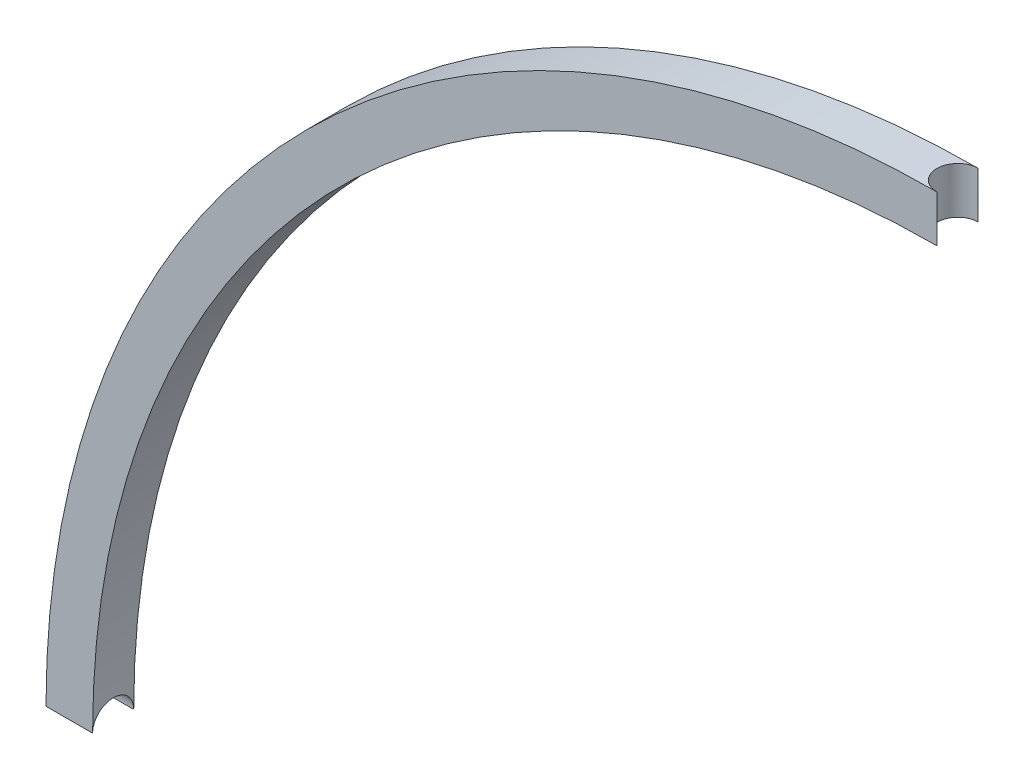
ISO-10303-21;
HEADER;
FILE_DESCRIPTION(('STEP AP214'),'2;1');
FILE_NAME('part.step','',(''),(''),'','','');
FILE_SCHEMA(('AUTOMOTIVE_DESIGN { 1 0 10303 214 1 1 1 1 }'));
ENDSEC;
DATA;
#1=APPLICATION_CONTEXT('core data for automotive mechanical design processes');
#2=APPLICATION_PROTOCOL_DEFINITION('international standard','automotive_design',2000,#1);
#3=PRODUCT_CONTEXT('',#1,'mechanical');
#4=PRODUCT('Part','Part','',(#3));
#5=PRODUCT_RELATED_PRODUCT_CATEGORY('part','',(#4));
#6=PRODUCT_DEFINITION_FORMATION('','',#4);
#7=PRODUCT_DEFINITION_CONTEXT('part definition',#1,'design');
#8=PRODUCT_DEFINITION('design','',#6,#7);
#9=PRODUCT_DEFINITION_SHAPE('','',#8);
#10=(LENGTH_UNIT() NAMED_UNIT(*) SI_UNIT(.MILLI.,.METRE.));
#11=(NAMED_UNIT(*) PLANE_ANGLE_UNIT() SI_UNIT($,.RADIAN.));
#12=(NAMED_UNIT(*) SI_UNIT($,.STERADIAN.) SOLID_ANGLE_UNIT());
#13=UNCERTAINTY_MEASURE_WITH_UNIT(LENGTH_MEASURE(1.E-05),#10,'distance_accuracy_value','');
#14=(GEOMETRIC_REPRESENTATION_CONTEXT(3) GLOBAL_UNCERTAINTY_ASSIGNED_CONTEXT((#13)) GLOBAL_UNIT_ASSIGNED_CONTEXT((#10,
#11,#12)) REPRESENTATION_CONTEXT('',''));
#15=CARTESIAN_POINT('',(0.,0.,0.));
#16=DIRECTION('',(0.,0.,1.));
#17=DIRECTION('',(1.,0.,0.));
#18=AXIS2_PLACEMENT_3D('',#15,#16,#17);
#19=CARTESIAN_POINT('',(0.,0.,6.));
#20=DIRECTION('',(0.,0.,-1.));
#21=DIRECTION('',(-1.,0.,0.));
#22=AXIS2_PLACEMENT_3D('',#19,#20,#21);
#23=CYLINDRICAL_SURFACE('',#22,130.);
#24=CARTESIAN_POINT('',(0.,0.,0.));
#25=DIRECTION('',(0.,0.,1.));
#26=DIRECTION('',(1.,0.,0.));
#27=AXIS2_PLACEMENT_3D('',#24,#25,#26);
#28=CIRCLE('',#27,130.);
#29=CARTESIAN_POINT('',(0.,130.,0.));
#30=VERTEX_POINT('',#29);
#31=CARTESIAN_POINT('',(-130.,0.,0.));
#32=VERTEX_POINT('',#31);
#33=EDGE_CURVE('E89',#30,#32,#28,.T.);
#34=ORIENTED_EDGE('',*,*,#33,.T.);
#35=CARTESIAN_POINT('',(-130.,0.,0.));
#36=CARTESIAN_POINT('',(-130.000000798049,0.084365703153941,-8.0962971110896E-06));
#37=CARTESIAN_POINT('',(-129.999917890793,0.168727556980415,0.00355875628193239));
#38=CARTESIAN_POINT('',(-129.999590558508,0.336847488970043,0.0177796983456663));
#39=CARTESIAN_POINT('',(-129.999346141371,0.420605596433004,0.0284334415308318));
#40=CARTESIAN_POINT('',(-129.998701911036,0.586870972359873,0.0567554061771578));
#41=CARTESIAN_POINT('',(-129.998302208857,0.669379090794983,0.0744186165310262));
#42=CARTESIAN_POINT('',(-129.997359444009,0.832593508303136,0.116616044330132));
#43=CARTESIAN_POINT('',(-129.996816383052,0.913299828883487,0.14115017971261));
#44=CARTESIAN_POINT('',(-129.994993140816,1.15193410518712,0.224859320547902));
#45=CARTESIAN_POINT('',(-129.993518605069,1.30644859979234,0.294153258378511));
#46=CARTESIAN_POINT('',(-129.990218638762,1.60153503918207,0.457644083543427));
#47=CARTESIAN_POINT('',(-129.988393275742,1.74210965969144,0.551836178963864));
#48=CARTESIAN_POINT('',(-129.984596472131,2.00550312142936,0.762505016025617));
#49=CARTESIAN_POINT('',(-129.982625004173,2.12831862322374,0.878985939327627));
#50=CARTESIAN_POINT('',(-129.978758245697,2.35266551308455,1.13092870158513));
#51=CARTESIAN_POINT('',(-129.976862966826,2.45419365730254,1.26639342812506));
#52=CARTESIAN_POINT('',(-129.9733624625,2.63307469087769,1.55245886178118));
#53=CARTESIAN_POINT('',(-129.971757256658,2.71042594587225,1.70306059125275));
#54=CARTESIAN_POINT('',(-129.969018225417,2.83873992133768,2.01510721109682));
#55=CARTESIAN_POINT('',(-129.967884369352,2.88970435868908,2.17655139522349));
#56=CARTESIAN_POINT('',(-129.966215952477,2.9637980011571,2.5056815069665));
#57=CARTESIAN_POINT('',(-129.965681295763,2.98693166077816,2.67336643127956));
#58=CARTESIAN_POINT('',(-129.965271270454,3.00472070422374,3.01024466723867));
#59=CARTESIAN_POINT('',(-129.965395916155,2.99937547045241,3.17943801151702));
#60=CARTESIAN_POINT('',(-129.966290372642,2.96036135808274,3.51449061284905));
#61=CARTESIAN_POINT('',(-129.967060054007,2.92669816116601,3.68035053188264));
#62=CARTESIAN_POINT('',(-129.969157605201,2.83201255034178,4.00406359212788));
#63=CARTESIAN_POINT('',(-129.970485473614,2.77099020580084,4.16191675363877));
#64=CARTESIAN_POINT('',(-129.973549885591,2.6233105983881,4.46515744295848));
#65=CARTESIAN_POINT('',(-129.975286479376,2.53665018500423,4.61054343591623));
#66=CARTESIAN_POINT('',(-129.978972406102,2.34016100176532,4.88469799333278));
#67=CARTESIAN_POINT('',(-129.980921728949,2.23033333097534,5.01346734562555));
#68=CARTESIAN_POINT('',(-129.984813725811,1.99061318132775,5.25075714906209));
#69=CARTESIAN_POINT('',(-129.986756399146,1.86071871351556,5.35927559064586));
#70=CARTESIAN_POINT('',(-129.990416549771,1.58450195642652,5.55300031091437));
#71=CARTESIAN_POINT('',(-129.992133955459,1.43817447133392,5.63819918695151));
#72=CARTESIAN_POINT('',(-129.995150158511,1.1332257407727,5.78286168587308));
#73=CARTESIAN_POINT('',(-129.996448698759,0.974597018167274,5.84230950946382));
#74=CARTESIAN_POINT('',(-129.998477330825,0.649730297538457,5.93363725182334));
#75=CARTESIAN_POINT('',(-129.999208290265,0.483504326461779,5.9655592557307));
#76=CARTESIAN_POINT('',(-129.99974376386,0.263475718418454,5.98887729445728));
#77=CARTESIAN_POINT('',(-129.999839803215,0.210820711678039,5.99305050653071));
#78=CARTESIAN_POINT('',(-129.999967835768,0.105450920465311,5.99860805275329));
#79=CARTESIAN_POINT('',(-129.999999934659,0.0527363790000908,5.99999698930483));
#80=CARTESIAN_POINT('',(-130.,0.,6.));
#81=B_SPLINE_CURVE_WITH_KNOTS('',3,(#35,#36,#37,#38,#39,#40,#41,#42,#43,#44,#45,#46,#47,#48,#49,
#50,#51,#52,#53,#54,#55,#56,#57,#58,#59,#60,#61,#62,#63,#64,#65,#66,#67,#68,#69,#70,#71,#72,#73,
#74,#75,#76,#77,#78,#79,#80),.UNSPECIFIED.,.F.,.F.,(4,2,2,2,2,2,2,2,2,2,2,2,2,2,2,2,2,2,2,2,2,2,
4),(0.,0.253014755685376,0.506017148762258,0.758838993916929,1.01165781962756,1.5170814164084,
2.02240780980587,2.52782910182344,3.03332735597248,3.53885977451868,4.04435929603712,
4.54977789816525,5.05520746089122,5.56053563902591,6.0658625359554,6.57125155535803,
7.07661660426945,7.58203177546916,8.08760720190797,8.59349238111221,9.09860271723869,
9.25701195808128,9.41515913209904),.UNSPECIFIED.);
#82=CARTESIAN_POINT('',(-130.,0.,6.));
#83=VERTEX_POINT('',#82);
#84=EDGE_CURVE('E64',#32,#83,#81,.T.);
#85=ORIENTED_EDGE('',*,*,#84,.T.);
#86=CARTESIAN_POINT('',(0.,0.,6.));
#87=DIRECTION('',(0.,0.,1.));
#88=DIRECTION('',(1.,0.,0.));
#89=AXIS2_PLACEMENT_3D('',#86,#87,#88);
#90=CIRCLE('',#89,130.);
#91=CARTESIAN_POINT('',(0.,130.,6.));
#92=VERTEX_POINT('',#91);
#93=EDGE_CURVE('E98',#92,#83,#90,.T.);
#94=ORIENTED_EDGE('',*,*,#93,.F.);
#95=CARTESIAN_POINT('',(0.,130.,0.));
#96=CARTESIAN_POINT('',(-0.0843657031539409,130.000000798049,-8.09629711057633E-06));
#97=CARTESIAN_POINT('',(-0.168727556980414,129.999917890793,0.00355875628193318));
#98=CARTESIAN_POINT('',(-0.336847488970043,129.999590558508,0.0177796983456679));
#99=CARTESIAN_POINT('',(-0.420605596433003,129.999346141371,0.0284334415308338));
#100=CARTESIAN_POINT('',(-0.586870972359872,129.998701911036,0.0567554061771609));
#101=CARTESIAN_POINT('',(-0.669379090794982,129.998302208857,0.0744186165310299));
#102=CARTESIAN_POINT('',(-0.832593508303135,129.997359444009,0.116616044330137));
#103=CARTESIAN_POINT('',(-0.913299828883486,129.996816383052,0.141150179712615));
#104=CARTESIAN_POINT('',(-1.15193410518712,129.994993140816,0.224859320547907));
#105=CARTESIAN_POINT('',(-1.30644859979234,129.993518605069,0.294153258378518));
#106=CARTESIAN_POINT('',(-1.60153503918207,129.990218638762,0.457644083543436));
#107=CARTESIAN_POINT('',(-1.74210965969144,129.988393275742,0.551836178963873));
#108=CARTESIAN_POINT('',(-2.00550312142936,129.984596472131,0.762505016025627));
#109=CARTESIAN_POINT('',(-2.12831862322374,129.982625004173,0.878985939327638));
#110=CARTESIAN_POINT('',(-2.35266551308455,129.978758245697,1.13092870158514));
#111=CARTESIAN_POINT('',(-2.45419365730253,129.976862966826,1.26639342812507));
#112=CARTESIAN_POINT('',(-2.63307469087768,129.9733624625,1.55245886178119));
#113=CARTESIAN_POINT('',(-2.71042594587224,129.971757256658,1.70306059125276));
#114=CARTESIAN_POINT('',(-2.83873992133767,129.969018225417,2.01510721109684));
#115=CARTESIAN_POINT('',(-2.88970435868906,129.967884369352,2.1765513952235));
#116=CARTESIAN_POINT('',(-2.96379800115709,129.966215952477,2.50568150696652));
#117=CARTESIAN_POINT('',(-2.98693166077815,129.965681295763,2.67336643127957));
#118=CARTESIAN_POINT('',(-3.00472070422372,129.965271270454,3.01024466723868));
#119=CARTESIAN_POINT('',(-2.9993754704524,129.965395916155,3.17943801151703));
#120=CARTESIAN_POINT('',(-2.96036135808272,129.966290372642,3.51449061284906));
#121=CARTESIAN_POINT('',(-2.92669816116599,129.967060054007,3.68035053188266));
#122=CARTESIAN_POINT('',(-2.83201255034176,129.969157605201,4.00406359212789));
#123=CARTESIAN_POINT('',(-2.77099020580081,129.970485473614,4.16191675363878));
#124=CARTESIAN_POINT('',(-2.62331059838808,129.973549885591,4.46515744295849));
#125=CARTESIAN_POINT('',(-2.53665018500421,129.975286479376,4.61054343591624));
#126=CARTESIAN_POINT('',(-2.3401610017653,129.978972406102,4.88469799333279));
#127=CARTESIAN_POINT('',(-2.23033333097532,129.980921728949,5.01346734562556));
#128=CARTESIAN_POINT('',(-1.99061318132772,129.984813725811,5.2507571490621));
#129=CARTESIAN_POINT('',(-1.86071871351553,129.986756399146,5.35927559064587));
#130=CARTESIAN_POINT('',(-1.5845019564265,129.990416549771,5.55300031091438));
#131=CARTESIAN_POINT('',(-1.43817447133389,129.992133955459,5.63819918695151));
#132=CARTESIAN_POINT('',(-1.13322574077267,129.995150158511,5.78286168587309));
#133=CARTESIAN_POINT('',(-0.974597018167244,129.996448698759,5.84230950946382));
#134=CARTESIAN_POINT('',(-0.649730297538426,129.998477330825,5.93363725182335));
#135=CARTESIAN_POINT('',(-0.483504326461748,129.999208290265,5.9655592557307));
#136=CARTESIAN_POINT('',(-0.263475718418429,129.99974376386,5.98887729445729));
#137=CARTESIAN_POINT('',(-0.210820711678021,129.999839803215,5.99305050653071));
#138=CARTESIAN_POINT('',(-0.105450920465305,129.999967835768,5.99860805275329));
#139=CARTESIAN_POINT('',(-0.052736379000092,129.999999934659,5.99999698930483));
#140=CARTESIAN_POINT('',(0.,130.,6.));
#141=B_SPLINE_CURVE_WITH_KNOTS('',3,(#95,#96,#97,#98,#99,#100,#101,#102,#103,#104,#105,#106,
#107,#108,#109,#110,#111,#112,#113,#114,#115,#116,#117,#118,#119,#120,#121,#122,#123,#124,#125,
#126,#127,#128,#129,#130,#131,#132,#133,#134,#135,#136,#137,#138,#139,#140),.UNSPECIFIED.,.F.,
.F.,(4,2,2,2,2,2,2,2,2,2,2,2,2,2,2,2,2,2,2,2,2,2,4),(0.,0.253014755685376,0.506017148762258,
0.758838993916929,1.01165781962756,1.5170814164084,2.02240780980587,2.52782910182344,
3.03332735597248,3.53885977451868,4.04435929603712,4.54977789816525,5.05520746089122,
5.5605356390259,6.0658625359554,6.57125155535803,7.07661660426945,7.58203177546916,
8.08760720190797,8.59349238111221,9.09860271723869,9.25701195808126,9.415159132099),.UNSPECIFIED.);
#142=EDGE_CURVE('E100',#30,#92,#141,.T.);
#143=ORIENTED_EDGE('',*,*,#142,.F.);
#144=EDGE_LOOP('',(#34,#85,#94,#143));
#145=FACE_BOUND('',#144,.T.);
#146=ADVANCED_FACE('F39',(#145),#23,.T.);
#147=CARTESIAN_POINT('',(0.,0.,6.));
#148=DIRECTION('',(0.,0.,-1.));
#149=DIRECTION('',(-1.,0.,0.));
#150=AXIS2_PLACEMENT_3D('',#147,#148,#149);
#151=CYLINDRICAL_SURFACE('',#150,123.2);
#152=CARTESIAN_POINT('',(0.,0.,6.));
#153=DIRECTION('',(0.,0.,-1.));
#154=DIRECTION('',(1.,0.,0.));
#155=AXIS2_PLACEMENT_3D('',#152,#153,#154);
#156=CIRCLE('',#155,123.2);
#157=CARTESIAN_POINT('',(-123.2,0.,6.));
#158=VERTEX_POINT('',#157);
#159=CARTESIAN_POINT('',(0.,123.2,6.));
#160=VERTEX_POINT('',#159);
#161=EDGE_CURVE('E48',#158,#160,#156,.T.);
#162=ORIENTED_EDGE('',*,*,#161,.F.);
#163=CARTESIAN_POINT('',(-123.2,0.,6.));
#164=CARTESIAN_POINT('',(-123.200000842052,0.0843643513266838,6.0000080977819));
#165=CARTESIAN_POINT('',(-123.199913361569,0.168724851612198,5.9964413578784));
#166=CARTESIAN_POINT('',(-123.199567973319,0.336842061291072,5.98222087524558));
#167=CARTESIAN_POINT('',(-123.1993100739,0.420598800051278,5.97156747959331));
#168=CARTESIAN_POINT('',(-123.198630307486,0.586861328286191,5.94324647299779));
#169=CARTESIAN_POINT('',(-123.198208557838,0.669367969214732,5.92558388169308));
#170=CARTESIAN_POINT('',(-123.197213789999,0.832579443619937,5.88338796957611));
#171=CARTESIAN_POINT('',(-123.196640773612,0.913284298561254,5.858854730661));
#172=CARTESIAN_POINT('',(-123.19471696022,1.15191413839225,5.77514875443041));
#173=CARTESIAN_POINT('',(-123.19316108721,1.3064257122113,5.70585754475401));
#174=CARTESIAN_POINT('',(-123.189679078203,1.6015069105172,5.54237338066292));
#175=CARTESIAN_POINT('',(-123.187753013303,1.74207920423125,5.4481852064699));
#176=CARTESIAN_POINT('',(-123.183746684683,2.00547153870324,5.23752321626111));
#177=CARTESIAN_POINT('',(-123.18166638919,2.12828790607942,5.12104480034409));
#178=CARTESIAN_POINT('',(-123.177586147976,2.35263714848361,4.86910690830544));
#179=CARTESIAN_POINT('',(-123.175586214538,2.45416677979808,4.73364454461311));
#180=CARTESIAN_POINT('',(-123.171892357923,2.6330525977781,4.44758147757402));
#181=CARTESIAN_POINT('',(-123.170198459323,2.71040684322417,4.29697955984375));
#182=CARTESIAN_POINT('',(-123.167308060459,2.83872657207655,3.98493155569872));
#183=CARTESIAN_POINT('',(-123.166111527773,2.88969377564695,3.82348617694157));
#184=CARTESIAN_POINT('',(-123.164350877006,2.96379163412874,3.49435621065471));
#185=CARTESIAN_POINT('',(-123.163786644781,2.98692731331599,3.32667275488795));
#186=CARTESIAN_POINT('',(-123.163353867908,3.00472078101313,2.98979701260237));
#187=CARTESIAN_POINT('',(-123.163485338243,2.99937795618582,2.82060469366573));
#188=CARTESIAN_POINT('',(-123.164429058124,2.96036944951741,2.48555752876695));
#189=CARTESIAN_POINT('',(-123.165241156368,2.92671006234529,2.319701949449));
#190=CARTESIAN_POINT('',(-123.167454339589,2.832033700844,1.99599692844452));
#191=CARTESIAN_POINT('',(-123.168855423114,2.77101679390306,1.83814746703804));
#192=CARTESIAN_POINT('',(-123.172088838056,2.62334883220783,1.53491144256401));
#193=CARTESIAN_POINT('',(-123.17392122719,2.53669434624452,1.38952655105527));
#194=CARTESIAN_POINT('',(-123.177810505668,2.34021781939139,1.11537291694138));
#195=CARTESIAN_POINT('',(-123.179867384407,2.23039687274863,0.986603389987179));
#196=CARTESIAN_POINT('',(-123.183974216361,1.99068731306011,0.74930839593419));
#197=CARTESIAN_POINT('',(-123.186024168673,1.86079617971917,0.640785475067477));
#198=CARTESIAN_POINT('',(-123.189886480742,1.58458502514993,0.447051218325188));
#199=CARTESIAN_POINT('',(-123.19169876498,1.43825980927447,0.361847282758876));
#200=CARTESIAN_POINT('',(-123.194881647246,1.13331417933229,0.217174276143165));
#201=CARTESIAN_POINT('',(-123.196251973728,0.974686280281571,0.157721019006399));
#202=CARTESIAN_POINT('',(-123.198392814396,0.649819826676942,0.0663825028496458));
#203=CARTESIAN_POINT('',(-123.199164244015,0.483593300380876,0.0344551612694365));
#204=CARTESIAN_POINT('',(-123.199729470229,0.263549095000742,0.0111289127585021));
#205=CARTESIAN_POINT('',(-123.19983086689,0.210879474984909,0.00695337246818607));
#206=CARTESIAN_POINT('',(-123.199966041529,0.105480357101798,0.00139272455963843));
#207=CARTESIAN_POINT('',(-123.199999931105,0.0527511024803368,3.01158085743942E-06));
#208=CARTESIAN_POINT('',(-123.2,0.,0.));
#209=B_SPLINE_CURVE_WITH_KNOTS('',3,(#163,#164,#165,#166,#167,#168,#169,#170,#171,#172,#173,
#174,#175,#176,#177,#178,#179,#180,#181,#182,#183,#184,#185,#186,#187,#188,#189,#190,#191,#192,
#193,#194,#195,#196,#197,#198,#199,#200,#201,#202,#203,#204,#205,#206,#207,#208),.UNSPECIFIED.,
.F.,.F.,(4,2,2,2,2,2,2,2,2,2,2,2,2,2,2,2,2,2,2,2,2,2,4),(0.,0.253010696471137,0.506009002367437,
0.758826449447011,1.01164088310658,1.5170554263672,2.02237300034158,2.5277949662926,
3.03329389352253,3.53883340055558,4.04433994745451,4.54975522426606,5.05518138617343,
5.56049522335984,6.065807815842,6.57118806752249,7.0765444533616,7.58196435051362,
8.08754445780624,8.59343461139235,9.09854996431468,9.25700343418001,9.41519474165561),.UNSPECIFIED.);
#210=CARTESIAN_POINT('',(-123.2,0.,0.));
#211=VERTEX_POINT('',#210);
#212=EDGE_CURVE('E82',#158,#211,#209,.T.);
#213=ORIENTED_EDGE('',*,*,#212,.T.);
#214=CARTESIAN_POINT('',(0.,0.,0.));
#215=DIRECTION('',(0.,0.,-1.));
#216=DIRECTION('',(1.,0.,0.));
#217=AXIS2_PLACEMENT_3D('',#214,#215,#216);
#218=CIRCLE('',#217,123.2);
#219=CARTESIAN_POINT('',(0.,123.2,0.));
#220=VERTEX_POINT('',#219);
#221=EDGE_CURVE('E88',#211,#220,#218,.T.);
#222=ORIENTED_EDGE('',*,*,#221,.T.);
#223=CARTESIAN_POINT('',(0.,123.2,6.));
#224=CARTESIAN_POINT('',(-0.0843643513266761,123.200000842052,6.0000080977819));
#225=CARTESIAN_POINT('',(-0.16872485161219,123.199913361569,5.9964413578784));
#226=CARTESIAN_POINT('',(-0.336842061291064,123.199567973319,5.98222087524558));
#227=CARTESIAN_POINT('',(-0.420598800051271,123.1993100739,5.97156747959331));
#228=CARTESIAN_POINT('',(-0.586861328286183,123.198630307486,5.94324647299779));
#229=CARTESIAN_POINT('',(-0.669367969214725,123.198208557838,5.92558388169308));
#230=CARTESIAN_POINT('',(-0.832579443619929,123.197213789999,5.8833879695761));
#231=CARTESIAN_POINT('',(-0.913284298561247,123.196640773612,5.85885473066099));
#232=CARTESIAN_POINT('',(-1.15191413839224,123.19471696022,5.77514875443041));
#233=CARTESIAN_POINT('',(-1.30642571221129,123.19316108721,5.705857544754));
#234=CARTESIAN_POINT('',(-1.6015069105172,123.189679078203,5.54237338066291));
#235=CARTESIAN_POINT('',(-1.74207920423124,123.187753013303,5.4481852064699));
#236=CARTESIAN_POINT('',(-2.00547153870323,123.183746684683,5.2375232162611));
#237=CARTESIAN_POINT('',(-2.12828790607941,123.18166638919,5.12104480034409));
#238=CARTESIAN_POINT('',(-2.3526371484836,123.177586147976,4.86910690830543));
#239=CARTESIAN_POINT('',(-2.45416677979807,123.175586214538,4.7336445446131));
#240=CARTESIAN_POINT('',(-2.63305259777809,123.171892357923,4.44758147757401));
#241=CARTESIAN_POINT('',(-2.71040684322416,123.170198459323,4.29697955984374));
#242=CARTESIAN_POINT('',(-2.83872657207654,123.167308060459,3.98493155569871));
#243=CARTESIAN_POINT('',(-2.88969377564694,123.166111527773,3.82348617694156));
#244=CARTESIAN_POINT('',(-2.96379163412873,123.164350877006,3.4943562106547));
#245=CARTESIAN_POINT('',(-2.98692731331598,123.163786644781,3.32667275488794));
#246=CARTESIAN_POINT('',(-3.00472078101312,123.163353867908,2.98979701260236));
#247=CARTESIAN_POINT('',(-2.99937795618581,123.163485338243,2.82060469366572));
#248=CARTESIAN_POINT('',(-2.96036944951739,123.164429058124,2.48555752876694));
#249=CARTESIAN_POINT('',(-2.92671006234527,123.165241156368,2.31970194944899));
#250=CARTESIAN_POINT('',(-2.83203370084398,123.167454339589,1.99599692844451));
#251=CARTESIAN_POINT('',(-2.77101679390304,123.168855423114,1.83814746703803));
#252=CARTESIAN_POINT('',(-2.62334883220781,123.172088838056,1.534911442564));
#253=CARTESIAN_POINT('',(-2.5366943462445,123.17392122719,1.38952655105526));
#254=CARTESIAN_POINT('',(-2.34021781939137,123.177810505668,1.11537291694137));
#255=CARTESIAN_POINT('',(-2.23039687274861,123.179867384407,0.986603389987173));
#256=CARTESIAN_POINT('',(-1.99068731306009,123.183974216361,0.749308395934184));
#257=CARTESIAN_POINT('',(-1.86079617971915,123.186024168673,0.640785475067472));
#258=CARTESIAN_POINT('',(-1.5845850251499,123.189886480742,0.447051218325184));
#259=CARTESIAN_POINT('',(-1.43825980927444,123.19169876498,0.361847282758872));
#260=CARTESIAN_POINT('',(-1.13331417933227,123.194881647246,0.217174276143162));
#261=CARTESIAN_POINT('',(-0.974686280281548,123.196251973728,0.157721019006397));
#262=CARTESIAN_POINT('',(-0.649819826676919,123.198392814396,0.0663825028496445));
#263=CARTESIAN_POINT('',(-0.483593300380853,123.199164244015,0.0344551612694353));
#264=CARTESIAN_POINT('',(-0.263549095000721,123.199729470229,0.0111289127585011));
#265=CARTESIAN_POINT('',(-0.210879474984889,123.19983086689,0.00695337246818518));
#266=CARTESIAN_POINT('',(-0.105480357101781,123.199966041529,0.00139272455963781));
#267=CARTESIAN_POINT('',(-0.0527511024803207,123.199999931105,3.01158085703999E-06));
#268=CARTESIAN_POINT('',(0.,123.2,0.));
#269=B_SPLINE_CURVE_WITH_KNOTS('',3,(#223,#224,#225,#226,#227,#228,#229,#230,#231,#232,#233,
#234,#235,#236,#237,#238,#239,#240,#241,#242,#243,#244,#245,#246,#247,#248,#249,#250,#251,#252,
#253,#254,#255,#256,#257,#258,#259,#260,#261,#262,#263,#264,#265,#266,#267,#268),.UNSPECIFIED.,
.F.,.F.,(4,2,2,2,2,2,2,2,2,2,2,2,2,2,2,2,2,2,2,2,2,2,4),(0.,0.253010696471136,0.506009002367437,
0.758826449447011,1.01164088310658,1.5170554263672,2.02237300034158,2.5277949662926,
3.03329389352253,3.53883340055558,4.04433994745451,4.54975522426606,5.05518138617343,
5.56049522335984,6.065807815842,6.57118806752249,7.07654445336161,7.58196435051362,
8.08754445780625,8.59343461139236,9.09854996431469,9.25700343418001,9.41519474165561),.UNSPECIFIED.);
#270=EDGE_CURVE('E56',#160,#220,#269,.T.);
#271=ORIENTED_EDGE('',*,*,#270,.F.);
#272=EDGE_LOOP('',(#162,#213,#222,#271));
#273=FACE_BOUND('',#272,.T.);
#274=ADVANCED_FACE('F93',(#273),#151,.F.);
#275=CARTESIAN_POINT('',(0.,0.,6.));
#276=DIRECTION('',(0.,0.,1.));
#277=DIRECTION('',(1.,0.,0.));
#278=AXIS2_PLACEMENT_3D('',#275,#276,#277);
#279=PLANE('',#278);
#280=ORIENTED_EDGE('',*,*,#93,.T.);
#281=DIRECTION('',(1.,0.,0.));
#282=VECTOR('',#281,1.);
#283=CARTESIAN_POINT('',(-123.2,0.,6.));
#284=LINE('',#283,#282);
#285=EDGE_CURVE('E103',#83,#158,#284,.T.);
#286=ORIENTED_EDGE('',*,*,#285,.T.);
#287=ORIENTED_EDGE('',*,*,#161,.T.);
#288=DIRECTION('',(0.,1.,0.));
#289=VECTOR('',#288,1.);
#290=CARTESIAN_POINT('',(0.,123.2,6.));
#291=LINE('',#290,#289);
#292=EDGE_CURVE('E11',#160,#92,#291,.T.);
#293=ORIENTED_EDGE('',*,*,#292,.T.);
#294=EDGE_LOOP('',(#280,#286,#287,#293));
#295=FACE_BOUND('',#294,.T.);
#296=ADVANCED_FACE('F124',(#295),#279,.T.);
#297=CARTESIAN_POINT('',(0.,0.,0.));
#298=DIRECTION('',(0.,0.,1.));
#299=DIRECTION('',(1.,0.,0.));
#300=AXIS2_PLACEMENT_3D('',#297,#298,#299);
#301=PLANE('',#300);
#302=ORIENTED_EDGE('',*,*,#33,.F.);
#303=DIRECTION('',(0.,1.,0.));
#304=VECTOR('',#303,1.);
#305=CARTESIAN_POINT('',(0.,123.2,0.));
#306=LINE('',#305,#304);
#307=EDGE_CURVE('E43',#220,#30,#306,.T.);
#308=ORIENTED_EDGE('',*,*,#307,.F.);
#309=ORIENTED_EDGE('',*,*,#221,.F.);
#310=DIRECTION('',(1.,0.,0.));
#311=VECTOR('',#310,1.);
#312=CARTESIAN_POINT('',(-123.2,0.,0.));
#313=LINE('',#312,#311);
#314=EDGE_CURVE('E79',#32,#211,#313,.T.);
#315=ORIENTED_EDGE('',*,*,#314,.F.);
#316=EDGE_LOOP('',(#302,#308,#309,#315));
#317=FACE_BOUND('',#316,.T.);
#318=ADVANCED_FACE('F97',(#317),#301,.F.);
#319=CARTESIAN_POINT('',(0.,144.,3.));
#320=DIRECTION('',(0.,-1.,0.));
#321=DIRECTION('',(0.,0.,-1.));
#322=AXIS2_PLACEMENT_3D('',#319,#320,#321);
#323=CYLINDRICAL_SURFACE('',#322,3.);
#324=ORIENTED_EDGE('',*,*,#270,.T.);
#325=ORIENTED_EDGE('',*,*,#307,.T.);
#326=ORIENTED_EDGE('',*,*,#142,.T.);
#327=ORIENTED_EDGE('',*,*,#292,.F.);
#328=EDGE_LOOP('',(#324,#325,#326,#327));
#329=FACE_BOUND('',#328,.T.);
#330=ADVANCED_FACE('F118',(#329),#323,.F.);
#331=CARTESIAN_POINT('',(-144.,0.,3.));
#332=DIRECTION('',(1.,0.,0.));
#333=DIRECTION('',(0.,0.,-1.));
#334=AXIS2_PLACEMENT_3D('',#331,#332,#333);
#335=CYLINDRICAL_SURFACE('',#334,3.);
#336=ORIENTED_EDGE('',*,*,#84,.F.);
#337=ORIENTED_EDGE('',*,*,#314,.T.);
#338=ORIENTED_EDGE('',*,*,#212,.F.);
#339=ORIENTED_EDGE('',*,*,#285,.F.);
#340=EDGE_LOOP('',(#336,#337,#338,#339));
#341=FACE_BOUND('',#340,.T.);
#342=ADVANCED_FACE('F81',(#341),#335,.F.);
#343=CLOSED_SHELL('',(#146,#274,#296,#318,#330,#342));
#344=MANIFOLD_SOLID_BREP('B2',#343);
#345=ADVANCED_BREP_SHAPE_REPRESENTATION('',(#18,#344),#14);
#346=SHAPE_DEFINITION_REPRESENTATION(#9,#345);
ENDSEC;
END-ISO-10303-21;
